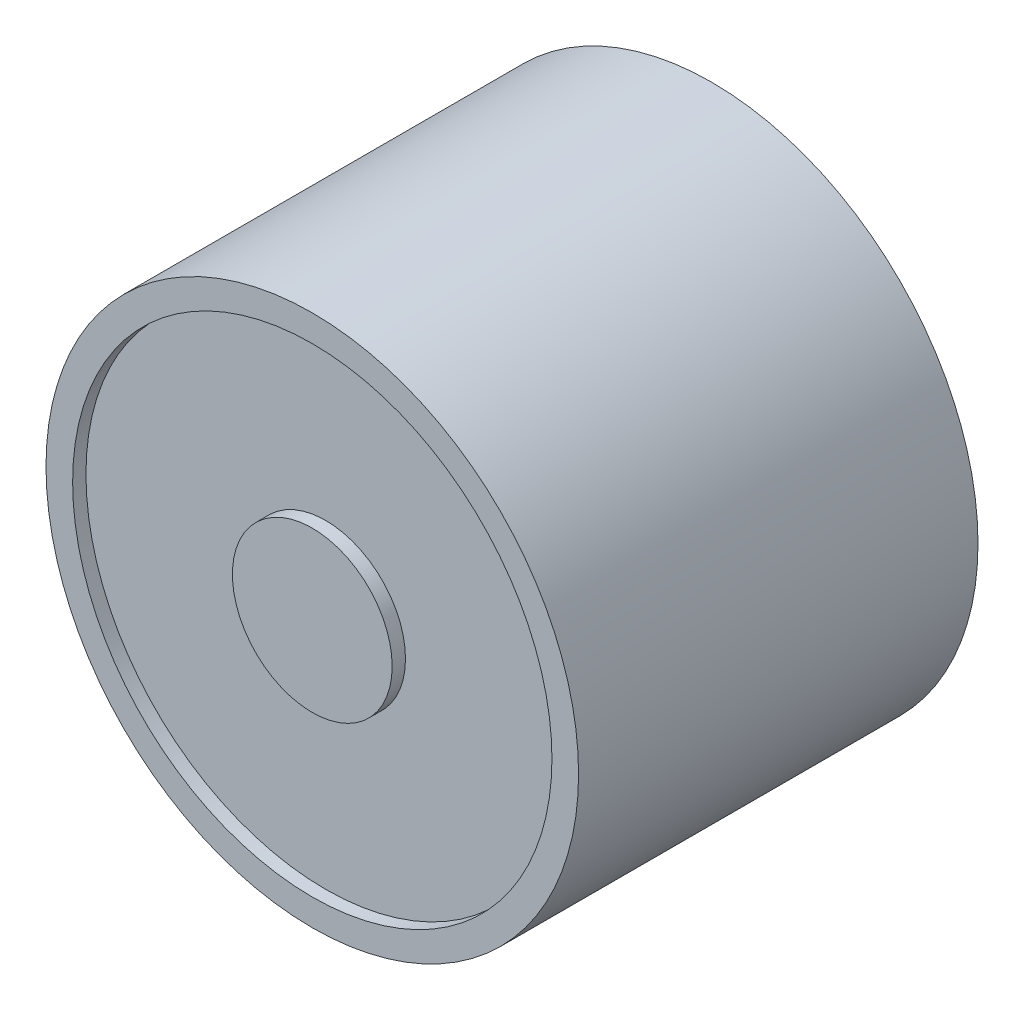
ISO-10303-21;
HEADER;
FILE_DESCRIPTION(('STEP AP214'),'2;1');
FILE_NAME('part.step','',(''),(''),'','','');
FILE_SCHEMA(('AUTOMOTIVE_DESIGN { 1 0 10303 214 1 1 1 1 }'));
ENDSEC;
DATA;
#1=APPLICATION_CONTEXT('core data for automotive mechanical design processes');
#2=APPLICATION_PROTOCOL_DEFINITION('international standard','automotive_design',2000,#1);
#3=PRODUCT_CONTEXT('',#1,'mechanical');
#4=PRODUCT('Part','Part','',(#3));
#5=PRODUCT_RELATED_PRODUCT_CATEGORY('part','',(#4));
#6=PRODUCT_DEFINITION_FORMATION('','',#4);
#7=PRODUCT_DEFINITION_CONTEXT('part definition',#1,'design');
#8=PRODUCT_DEFINITION('design','',#6,#7);
#9=PRODUCT_DEFINITION_SHAPE('','',#8);
#10=(LENGTH_UNIT() NAMED_UNIT(*) SI_UNIT(.MILLI.,.METRE.));
#11=(NAMED_UNIT(*) PLANE_ANGLE_UNIT() SI_UNIT($,.RADIAN.));
#12=(NAMED_UNIT(*) SI_UNIT($,.STERADIAN.) SOLID_ANGLE_UNIT());
#13=UNCERTAINTY_MEASURE_WITH_UNIT(LENGTH_MEASURE(1.E-05),#10,'distance_accuracy_value','');
#14=(GEOMETRIC_REPRESENTATION_CONTEXT(3) GLOBAL_UNCERTAINTY_ASSIGNED_CONTEXT((#13)) GLOBAL_UNIT_ASSIGNED_CONTEXT((#10,
#11,#12)) REPRESENTATION_CONTEXT('',''));
#15=CARTESIAN_POINT('',(0.,0.,0.));
#16=DIRECTION('',(0.,0.,1.));
#17=DIRECTION('',(1.,0.,0.));
#18=AXIS2_PLACEMENT_3D('',#15,#16,#17);
#19=CARTESIAN_POINT('',(0.,0.,15.));
#20=DIRECTION('',(0.,0.,-1.));
#21=DIRECTION('',(-1.,0.,0.));
#22=AXIS2_PLACEMENT_3D('',#19,#20,#21);
#23=CYLINDRICAL_SURFACE('',#22,10.);
#24=CARTESIAN_POINT('',(0.,0.,15.));
#25=DIRECTION('',(0.,0.,1.));
#26=DIRECTION('',(1.,0.,0.));
#27=AXIS2_PLACEMENT_3D('',#24,#25,#26);
#28=CIRCLE('',#27,10.);
#29=CARTESIAN_POINT('',(10.,0.,15.));
#30=VERTEX_POINT('',#29);
#31=EDGE_CURVE('E10',#30,#30,#28,.T.);
#32=ORIENTED_EDGE('',*,*,#31,.F.);
#33=EDGE_LOOP('',(#32));
#34=FACE_BOUND('',#33,.T.);
#35=CARTESIAN_POINT('',(0.,0.,0.));
#36=DIRECTION('',(0.,0.,1.));
#37=DIRECTION('',(1.,0.,0.));
#38=AXIS2_PLACEMENT_3D('',#35,#36,#37);
#39=CIRCLE('',#38,10.);
#40=CARTESIAN_POINT('',(10.,0.,0.));
#41=VERTEX_POINT('',#40);
#42=EDGE_CURVE('E36',#41,#41,#39,.T.);
#43=ORIENTED_EDGE('',*,*,#42,.T.);
#44=EDGE_LOOP('',(#43));
#45=FACE_BOUND('',#44,.T.);
#46=ADVANCED_FACE('F33',(#34,#45),#23,.T.);
#47=CARTESIAN_POINT('',(0.,0.,15.));
#48=DIRECTION('',(0.,0.,1.));
#49=DIRECTION('',(1.,0.,0.));
#50=AXIS2_PLACEMENT_3D('',#47,#48,#49);
#51=PLANE('',#50);
#52=CARTESIAN_POINT('',(0.,0.,15.));
#53=DIRECTION('',(0.,0.,1.));
#54=DIRECTION('',(1.,0.,0.));
#55=AXIS2_PLACEMENT_3D('',#52,#53,#54);
#56=CIRCLE('',#55,9.);
#57=CARTESIAN_POINT('',(9.,0.,15.));
#58=VERTEX_POINT('',#57);
#59=EDGE_CURVE('E45',#58,#58,#56,.T.);
#60=ORIENTED_EDGE('',*,*,#59,.F.);
#61=EDGE_LOOP('',(#60));
#62=FACE_BOUND('',#61,.T.);
#63=ORIENTED_EDGE('',*,*,#31,.T.);
#64=EDGE_LOOP('',(#63));
#65=FACE_BOUND('',#64,.T.);
#66=ADVANCED_FACE('F76',(#62,#65),#51,.T.);
#67=CARTESIAN_POINT('',(0.,0.,0.));
#68=DIRECTION('',(0.,0.,1.));
#69=DIRECTION('',(1.,0.,0.));
#70=AXIS2_PLACEMENT_3D('',#67,#68,#69);
#71=PLANE('',#70);
#72=CARTESIAN_POINT('',(0.,0.,0.));
#73=DIRECTION('',(0.,0.,-1.));
#74=DIRECTION('',(-1.,0.,0.));
#75=AXIS2_PLACEMENT_3D('',#72,#73,#74);
#76=CIRCLE('',#75,2.);
#77=CARTESIAN_POINT('',(-2.,0.,0.));
#78=VERTEX_POINT('',#77);
#79=EDGE_CURVE('E57',#78,#78,#76,.T.);
#80=ORIENTED_EDGE('',*,*,#79,.F.);
#81=EDGE_LOOP('',(#80));
#82=FACE_BOUND('',#81,.T.);
#83=ORIENTED_EDGE('',*,*,#42,.F.);
#84=EDGE_LOOP('',(#83));
#85=FACE_BOUND('',#84,.T.);
#86=ADVANCED_FACE('F72',(#82,#85),#71,.F.);
#87=CARTESIAN_POINT('',(0.,0.,14.5));
#88=DIRECTION('',(0.,0.,1.));
#89=DIRECTION('',(1.,0.,0.));
#90=AXIS2_PLACEMENT_3D('',#87,#88,#89);
#91=CYLINDRICAL_SURFACE('',#90,9.);
#92=CARTESIAN_POINT('',(0.,0.,14.5));
#93=DIRECTION('',(0.,0.,1.));
#94=DIRECTION('',(1.,0.,0.));
#95=AXIS2_PLACEMENT_3D('',#92,#93,#94);
#96=CIRCLE('',#95,9.);
#97=CARTESIAN_POINT('',(9.,0.,14.5));
#98=VERTEX_POINT('',#97);
#99=EDGE_CURVE('E43',#98,#98,#96,.T.);
#100=ORIENTED_EDGE('',*,*,#99,.F.);
#101=EDGE_LOOP('',(#100));
#102=FACE_BOUND('',#101,.T.);
#103=ORIENTED_EDGE('',*,*,#59,.T.);
#104=EDGE_LOOP('',(#103));
#105=FACE_BOUND('',#104,.T.);
#106=ADVANCED_FACE('F75',(#102,#105),#91,.F.);
#107=CARTESIAN_POINT('',(0.,0.,14.5));
#108=DIRECTION('',(0.,0.,1.));
#109=DIRECTION('',(1.,0.,0.));
#110=AXIS2_PLACEMENT_3D('',#107,#108,#109);
#111=PLANE('',#110);
#112=CARTESIAN_POINT('',(0.,0.,14.5));
#113=DIRECTION('',(0.,0.,1.));
#114=DIRECTION('',(1.,0.,0.));
#115=AXIS2_PLACEMENT_3D('',#112,#113,#114);
#116=CIRCLE('',#115,3.);
#117=CARTESIAN_POINT('',(3.,0.,14.5));
#118=VERTEX_POINT('',#117);
#119=EDGE_CURVE('E48',#118,#118,#116,.T.);
#120=ORIENTED_EDGE('',*,*,#119,.F.);
#121=EDGE_LOOP('',(#120));
#122=FACE_BOUND('',#121,.T.);
#123=ORIENTED_EDGE('',*,*,#99,.T.);
#124=EDGE_LOOP('',(#123));
#125=FACE_BOUND('',#124,.T.);
#126=ADVANCED_FACE('F97',(#122,#125),#111,.T.);
#127=CARTESIAN_POINT('',(0.,0.,14.5));
#128=DIRECTION('',(0.,0.,1.));
#129=DIRECTION('',(1.,0.,0.));
#130=AXIS2_PLACEMENT_3D('',#127,#128,#129);
#131=CYLINDRICAL_SURFACE('',#130,3.);
#132=ORIENTED_EDGE('',*,*,#119,.T.);
#133=EDGE_LOOP('',(#132));
#134=FACE_BOUND('',#133,.T.);
#135=CARTESIAN_POINT('',(0.,0.,15.));
#136=DIRECTION('',(0.,0.,1.));
#137=DIRECTION('',(1.,0.,0.));
#138=AXIS2_PLACEMENT_3D('',#135,#136,#137);
#139=CIRCLE('',#138,3.);
#140=CARTESIAN_POINT('',(3.,0.,15.));
#141=VERTEX_POINT('',#140);
#142=EDGE_CURVE('E51',#141,#141,#139,.T.);
#143=ORIENTED_EDGE('',*,*,#142,.F.);
#144=EDGE_LOOP('',(#143));
#145=FACE_BOUND('',#144,.T.);
#146=ADVANCED_FACE('F92',(#134,#145),#131,.T.);
#147=ORIENTED_EDGE('',*,*,#142,.T.);
#148=EDGE_LOOP('',(#147));
#149=FACE_BOUND('',#148,.T.);
#150=ADVANCED_FACE('F68',(#149),#51,.T.);
#151=CARTESIAN_POINT('',(0.,0.,3.));
#152=DIRECTION('',(0.,0.,-1.));
#153=DIRECTION('',(-1.,0.,0.));
#154=AXIS2_PLACEMENT_3D('',#151,#152,#153);
#155=CYLINDRICAL_SURFACE('',#154,2.);
#156=CARTESIAN_POINT('',(0.,0.,3.));
#157=DIRECTION('',(0.,0.,-1.));
#158=DIRECTION('',(-1.,0.,0.));
#159=AXIS2_PLACEMENT_3D('',#156,#157,#158);
#160=CIRCLE('',#159,2.);
#161=CARTESIAN_POINT('',(-2.,0.,3.));
#162=VERTEX_POINT('',#161);
#163=EDGE_CURVE('E54',#162,#162,#160,.T.);
#164=ORIENTED_EDGE('',*,*,#163,.F.);
#165=EDGE_LOOP('',(#164));
#166=FACE_BOUND('',#165,.T.);
#167=ORIENTED_EDGE('',*,*,#79,.T.);
#168=EDGE_LOOP('',(#167));
#169=FACE_BOUND('',#168,.T.);
#170=ADVANCED_FACE('F65',(#166,#169),#155,.F.);
#171=CARTESIAN_POINT('',(0.,0.,3.));
#172=DIRECTION('',(0.,0.,-1.));
#173=DIRECTION('',(-1.,0.,0.));
#174=AXIS2_PLACEMENT_3D('',#171,#172,#173);
#175=PLANE('',#174);
#176=ORIENTED_EDGE('',*,*,#163,.T.);
#177=EDGE_LOOP('',(#176));
#178=FACE_BOUND('',#177,.T.);
#179=ADVANCED_FACE('F63',(#178),#175,.T.);
#180=CLOSED_SHELL('',(#46,#66,#86,#106,#126,#146,#150,#170,#179));
#181=MANIFOLD_SOLID_BREP('B2',#180);
#182=ADVANCED_BREP_SHAPE_REPRESENTATION('',(#18,#181),#14);
#183=SHAPE_DEFINITION_REPRESENTATION(#9,#182);
ENDSEC;
END-ISO-10303-21;
